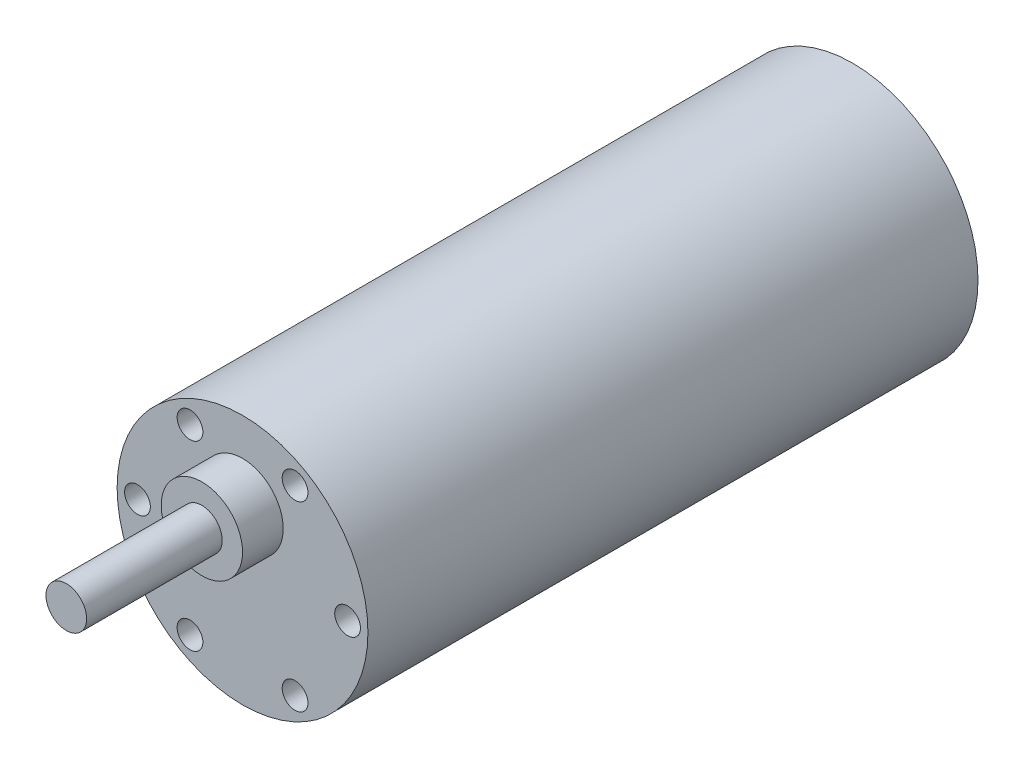
ISO-10303-21;
HEADER;
FILE_DESCRIPTION(('STEP AP214'),'2;1');
FILE_NAME('part.step','',(''),(''),'','','');
FILE_SCHEMA(('AUTOMOTIVE_DESIGN { 1 0 10303 214 1 1 1 1 }'));
ENDSEC;
DATA;
#1=APPLICATION_CONTEXT('core data for automotive mechanical design processes');
#2=APPLICATION_PROTOCOL_DEFINITION('international standard','automotive_design',2000,#1);
#3=PRODUCT_CONTEXT('',#1,'mechanical');
#4=PRODUCT('Part','Part','',(#3));
#5=PRODUCT_RELATED_PRODUCT_CATEGORY('part','',(#4));
#6=PRODUCT_DEFINITION_FORMATION('','',#4);
#7=PRODUCT_DEFINITION_CONTEXT('part definition',#1,'design');
#8=PRODUCT_DEFINITION('design','',#6,#7);
#9=PRODUCT_DEFINITION_SHAPE('','',#8);
#10=(LENGTH_UNIT() NAMED_UNIT(*) SI_UNIT(.MILLI.,.METRE.));
#11=(NAMED_UNIT(*) PLANE_ANGLE_UNIT() SI_UNIT($,.RADIAN.));
#12=(NAMED_UNIT(*) SI_UNIT($,.STERADIAN.) SOLID_ANGLE_UNIT());
#13=UNCERTAINTY_MEASURE_WITH_UNIT(LENGTH_MEASURE(1.E-05),#10,'distance_accuracy_value','');
#14=(GEOMETRIC_REPRESENTATION_CONTEXT(3) GLOBAL_UNCERTAINTY_ASSIGNED_CONTEXT((#13)) GLOBAL_UNIT_ASSIGNED_CONTEXT((#10,
#11,#12)) REPRESENTATION_CONTEXT('',''));
#15=CARTESIAN_POINT('',(0.,0.,0.));
#16=DIRECTION('',(0.,0.,1.));
#17=DIRECTION('',(1.,0.,0.));
#18=AXIS2_PLACEMENT_3D('',#15,#16,#17);
#19=CARTESIAN_POINT('',(0.,0.,90.));
#20=DIRECTION('',(0.,0.,-1.));
#21=DIRECTION('',(-1.,0.,0.));
#22=AXIS2_PLACEMENT_3D('',#19,#20,#21);
#23=CYLINDRICAL_SURFACE('',#22,18.5);
#24=CARTESIAN_POINT('',(0.,0.,90.));
#25=DIRECTION('',(0.,0.,1.));
#26=DIRECTION('',(1.,0.,0.));
#27=AXIS2_PLACEMENT_3D('',#24,#25,#26);
#28=CIRCLE('',#27,18.5);
#29=CARTESIAN_POINT('',(-18.5,0.,90.));
#30=VERTEX_POINT('',#29);
#31=EDGE_CURVE('E48',#30,#30,#28,.T.);
#32=CARTESIAN_POINT('',(0.,0.,0.));
#33=DIRECTION('',(0.,0.,1.));
#34=DIRECTION('',(1.,0.,0.));
#35=AXIS2_PLACEMENT_3D('',#32,#33,#34);
#36=CIRCLE('',#35,18.5);
#37=CARTESIAN_POINT('',(-18.5,0.,0.));
#38=VERTEX_POINT('',#37);
#39=EDGE_CURVE('E44',#38,#38,#36,.T.);
#40=CARTESIAN_POINT('',(-18.5,0.,90.));
#41=CARTESIAN_POINT('',(-18.5,0.,89.0625));
#42=CARTESIAN_POINT('',(-18.5,0.,88.125));
#43=CARTESIAN_POINT('',(-18.5,0.,86.25));
#44=CARTESIAN_POINT('',(-18.5,0.,85.3125));
#45=CARTESIAN_POINT('',(-18.5,0.,83.4375));
#46=CARTESIAN_POINT('',(-18.5,0.,82.5));
#47=CARTESIAN_POINT('',(-18.5,0.,80.625));
#48=CARTESIAN_POINT('',(-18.5,0.,79.6875));
#49=CARTESIAN_POINT('',(-18.5,0.,77.8125));
#50=CARTESIAN_POINT('',(-18.5,0.,76.875));
#51=CARTESIAN_POINT('',(-18.5,0.,75.));
#52=CARTESIAN_POINT('',(-18.5,0.,74.0625));
#53=CARTESIAN_POINT('',(-18.5,0.,72.1875));
#54=CARTESIAN_POINT('',(-18.5,0.,71.25));
#55=CARTESIAN_POINT('',(-18.5,0.,69.375));
#56=CARTESIAN_POINT('',(-18.5,0.,68.4375));
#57=CARTESIAN_POINT('',(-18.5,0.,66.5625));
#58=CARTESIAN_POINT('',(-18.5,0.,65.625));
#59=CARTESIAN_POINT('',(-18.5,0.,63.75));
#60=CARTESIAN_POINT('',(-18.5,0.,62.8125));
#61=CARTESIAN_POINT('',(-18.5,0.,60.9375));
#62=CARTESIAN_POINT('',(-18.5,0.,60.));
#63=CARTESIAN_POINT('',(-18.5,0.,58.125));
#64=CARTESIAN_POINT('',(-18.5,0.,57.1875));
#65=CARTESIAN_POINT('',(-18.5,0.,55.3125));
#66=CARTESIAN_POINT('',(-18.5,0.,54.375));
#67=CARTESIAN_POINT('',(-18.5,0.,52.5));
#68=CARTESIAN_POINT('',(-18.5,0.,51.5625));
#69=CARTESIAN_POINT('',(-18.5,0.,49.6875));
#70=CARTESIAN_POINT('',(-18.5,0.,48.75));
#71=CARTESIAN_POINT('',(-18.5,0.,46.875));
#72=CARTESIAN_POINT('',(-18.5,0.,45.9375));
#73=CARTESIAN_POINT('',(-18.5,0.,44.0625));
#74=CARTESIAN_POINT('',(-18.5,0.,43.125));
#75=CARTESIAN_POINT('',(-18.5,0.,41.25));
#76=CARTESIAN_POINT('',(-18.5,0.,40.3125));
#77=CARTESIAN_POINT('',(-18.5,0.,38.4375));
#78=CARTESIAN_POINT('',(-18.5,0.,37.5));
#79=CARTESIAN_POINT('',(-18.5,0.,35.625));
#80=CARTESIAN_POINT('',(-18.5,0.,34.6875));
#81=CARTESIAN_POINT('',(-18.5,0.,32.8125));
#82=CARTESIAN_POINT('',(-18.5,0.,31.875));
#83=CARTESIAN_POINT('',(-18.5,0.,30.));
#84=CARTESIAN_POINT('',(-18.5,0.,29.0625));
#85=CARTESIAN_POINT('',(-18.5,0.,27.1875));
#86=CARTESIAN_POINT('',(-18.5,0.,26.25));
#87=CARTESIAN_POINT('',(-18.5,0.,24.375));
#88=CARTESIAN_POINT('',(-18.5,0.,23.4375));
#89=CARTESIAN_POINT('',(-18.5,0.,21.5625));
#90=CARTESIAN_POINT('',(-18.5,0.,20.625));
#91=CARTESIAN_POINT('',(-18.5,0.,18.75));
#92=CARTESIAN_POINT('',(-18.5,0.,17.8125));
#93=CARTESIAN_POINT('',(-18.5,0.,15.9375));
#94=CARTESIAN_POINT('',(-18.5,0.,15.));
#95=CARTESIAN_POINT('',(-18.5,0.,13.125));
#96=CARTESIAN_POINT('',(-18.5,0.,12.1875));
#97=CARTESIAN_POINT('',(-18.5,0.,10.3125));
#98=CARTESIAN_POINT('',(-18.5,0.,9.37499999999999));
#99=CARTESIAN_POINT('',(-18.5,0.,7.49999999999999));
#100=CARTESIAN_POINT('',(-18.5,0.,6.56249999999999));
#101=CARTESIAN_POINT('',(-18.5,0.,4.68749999999999));
#102=CARTESIAN_POINT('',(-18.5,0.,3.74999999999998));
#103=CARTESIAN_POINT('',(-18.5,0.,1.87499999999998));
#104=CARTESIAN_POINT('',(-18.5,0.,0.937499999999986));
#105=CARTESIAN_POINT('',(-18.5,0.,0.));
#106=B_SPLINE_CURVE_WITH_KNOTS('',3,(#40,#41,#42,#43,#44,#45,#46,#47,#48,#49,#50,#51,#52,#53,
#54,#55,#56,#57,#58,#59,#60,#61,#62,#63,#64,#65,#66,#67,#68,#69,#70,#71,#72,#73,#74,#75,#76,#77,
#78,#79,#80,#81,#82,#83,#84,#85,#86,#87,#88,#89,#90,#91,#92,#93,#94,#95,#96,#97,#98,#99,#100,
#101,#102,#103,#104,#105),.UNSPECIFIED.,.F.,.F.,(4,2,2,2,2,2,2,2,2,2,2,2,2,2,2,2,2,2,2,2,2,2,2,
2,2,2,2,2,2,2,2,2,4),(0.,2.8125,5.62499999999999,8.43749999999999,11.25,14.0625,16.875,19.6875,
22.5,25.3125,28.125,30.9375,33.75,36.5625,39.375,42.1875,45.,47.8125,50.625,53.4375,56.25,
59.0625,61.875,64.6875,67.5,70.3125,73.125,75.9375,78.75,81.5625,84.375,87.1875,90.),.UNSPECIFIED.);
#107=EDGE_CURVE('BSEAM41',#30,#38,#106,.T.);
#108=ORIENTED_EDGE('',*,*,#31,.F.);
#109=ORIENTED_EDGE('',*,*,#39,.T.);
#110=ORIENTED_EDGE('',*,*,#107,.T.);
#111=ORIENTED_EDGE('',*,*,#107,.F.);
#112=EDGE_LOOP('',(#108,#110,#109,#111));
#113=FACE_BOUND('',#112,.T.);
#114=ADVANCED_FACE('F41',(#113),#23,.T.);
#115=CARTESIAN_POINT('',(0.,0.,90.));
#116=DIRECTION('',(0.,0.,1.));
#117=DIRECTION('',(1.,0.,0.));
#118=AXIS2_PLACEMENT_3D('',#115,#116,#117);
#119=PLANE('',#118);
#120=CARTESIAN_POINT('',(0.,7.,90.));
#121=DIRECTION('',(0.,0.,1.));
#122=DIRECTION('',(1.,0.,0.));
#123=AXIS2_PLACEMENT_3D('',#120,#121,#122);
#124=CIRCLE('',#123,5.99999999999997);
#125=CARTESIAN_POINT('',(5.99999999999997,7.,90.));
#126=VERTEX_POINT('',#125);
#127=EDGE_CURVE('E60',#126,#126,#124,.T.);
#128=ORIENTED_EDGE('',*,*,#127,.F.);
#129=EDGE_LOOP('',(#128));
#130=FACE_BOUND('',#129,.T.);
#131=CARTESIAN_POINT('',(15.5,0.,90.));
#132=DIRECTION('',(0.,0.,1.));
#133=DIRECTION('',(1.,0.,0.));
#134=AXIS2_PLACEMENT_3D('',#131,#132,#133);
#135=CIRCLE('',#134,1.9);
#136=CARTESIAN_POINT('',(17.4,0.,90.));
#137=VERTEX_POINT('',#136);
#138=EDGE_CURVE('E66',#137,#137,#135,.T.);
#139=ORIENTED_EDGE('',*,*,#138,.F.);
#140=EDGE_LOOP('',(#139));
#141=FACE_BOUND('',#140,.T.);
#142=CARTESIAN_POINT('',(7.75,13.4233937586588,90.));
#143=DIRECTION('',(0.,0.,1.));
#144=DIRECTION('',(1.,0.,0.));
#145=AXIS2_PLACEMENT_3D('',#142,#143,#144);
#146=CIRCLE('',#145,1.90000000000002);
#147=CARTESIAN_POINT('',(9.65000000000002,13.4233937586588,90.));
#148=VERTEX_POINT('',#147);
#149=EDGE_CURVE('E59',#148,#148,#146,.T.);
#150=ORIENTED_EDGE('',*,*,#149,.F.);
#151=EDGE_LOOP('',(#150));
#152=FACE_BOUND('',#151,.T.);
#153=CARTESIAN_POINT('',(-7.75000000000001,13.4233937586588,90.));
#154=DIRECTION('',(0.,0.,1.));
#155=DIRECTION('',(1.,0.,0.));
#156=AXIS2_PLACEMENT_3D('',#153,#154,#155);
#157=CIRCLE('',#156,1.9);
#158=CARTESIAN_POINT('',(-5.85,13.4233937586588,90.));
#159=VERTEX_POINT('',#158);
#160=EDGE_CURVE('E73',#159,#159,#157,.T.);
#161=ORIENTED_EDGE('',*,*,#160,.F.);
#162=EDGE_LOOP('',(#161));
#163=FACE_BOUND('',#162,.T.);
#164=CARTESIAN_POINT('',(-15.5,0.,90.));
#165=DIRECTION('',(0.,0.,1.));
#166=DIRECTION('',(1.,0.,0.));
#167=AXIS2_PLACEMENT_3D('',#164,#165,#166);
#168=CIRCLE('',#167,1.9);
#169=CARTESIAN_POINT('',(-13.6,0.,90.));
#170=VERTEX_POINT('',#169);
#171=EDGE_CURVE('E90',#170,#170,#168,.T.);
#172=ORIENTED_EDGE('',*,*,#171,.F.);
#173=EDGE_LOOP('',(#172));
#174=FACE_BOUND('',#173,.T.);
#175=CARTESIAN_POINT('',(-7.75,-13.4233937586588,90.));
#176=DIRECTION('',(0.,0.,1.));
#177=DIRECTION('',(1.,0.,0.));
#178=AXIS2_PLACEMENT_3D('',#175,#176,#177);
#179=CIRCLE('',#178,1.9);
#180=CARTESIAN_POINT('',(-5.85,-13.4233937586588,90.));
#181=VERTEX_POINT('',#180);
#182=EDGE_CURVE('E84',#181,#181,#179,.T.);
#183=ORIENTED_EDGE('',*,*,#182,.F.);
#184=EDGE_LOOP('',(#183));
#185=FACE_BOUND('',#184,.T.);
#186=CARTESIAN_POINT('',(7.75,-13.4233937586588,90.));
#187=DIRECTION('',(0.,0.,1.));
#188=DIRECTION('',(1.,0.,0.));
#189=AXIS2_PLACEMENT_3D('',#186,#187,#188);
#190=CIRCLE('',#189,1.9);
#191=CARTESIAN_POINT('',(9.65,-13.4233937586588,90.));
#192=VERTEX_POINT('',#191);
#193=EDGE_CURVE('E78',#192,#192,#190,.T.);
#194=ORIENTED_EDGE('',*,*,#193,.F.);
#195=EDGE_LOOP('',(#194));
#196=FACE_BOUND('',#195,.T.);
#197=ORIENTED_EDGE('',*,*,#31,.T.);
#198=EDGE_LOOP('',(#197));
#199=FACE_BOUND('',#198,.T.);
#200=ADVANCED_FACE('F101',(#130,#141,#152,#163,#174,#185,#196,#199),#119,.T.);
#201=CARTESIAN_POINT('',(0.,0.,0.));
#202=DIRECTION('',(0.,0.,1.));
#203=DIRECTION('',(1.,0.,0.));
#204=AXIS2_PLACEMENT_3D('',#201,#202,#203);
#205=PLANE('',#204);
#206=ORIENTED_EDGE('',*,*,#39,.F.);
#207=EDGE_LOOP('',(#206));
#208=FACE_BOUND('',#207,.T.);
#209=ADVANCED_FACE('F104',(#208),#205,.F.);
#210=CARTESIAN_POINT('',(7.75,-13.4233937586588,87.));
#211=DIRECTION('',(0.,0.,1.));
#212=DIRECTION('',(1.,0.,0.));
#213=AXIS2_PLACEMENT_3D('',#210,#211,#212);
#214=CYLINDRICAL_SURFACE('',#213,1.9);
#215=CARTESIAN_POINT('',(7.75,-13.4233937586588,87.));
#216=DIRECTION('',(0.,0.,1.));
#217=DIRECTION('',(1.,0.,0.));
#218=AXIS2_PLACEMENT_3D('',#215,#216,#217);
#219=CIRCLE('',#218,1.9);
#220=CARTESIAN_POINT('',(9.65,-13.4233937586588,87.));
#221=VERTEX_POINT('',#220);
#222=EDGE_CURVE('E69',#221,#221,#219,.T.);
#223=ORIENTED_EDGE('',*,*,#222,.F.);
#224=EDGE_LOOP('',(#223));
#225=FACE_BOUND('',#224,.T.);
#226=ORIENTED_EDGE('',*,*,#193,.T.);
#227=EDGE_LOOP('',(#226));
#228=FACE_BOUND('',#227,.T.);
#229=ADVANCED_FACE('F121',(#225,#228),#214,.F.);
#230=CARTESIAN_POINT('',(0.,0.,87.));
#231=DIRECTION('',(0.,0.,1.));
#232=DIRECTION('',(1.,0.,0.));
#233=AXIS2_PLACEMENT_3D('',#230,#231,#232);
#234=PLANE('',#233);
#235=ORIENTED_EDGE('',*,*,#222,.T.);
#236=EDGE_LOOP('',(#235));
#237=FACE_BOUND('',#236,.T.);
#238=ADVANCED_FACE('F125',(#237),#234,.T.);
#239=CARTESIAN_POINT('',(-7.75,-13.4233937586588,87.));
#240=DIRECTION('',(0.,0.,1.));
#241=DIRECTION('',(1.,0.,0.));
#242=AXIS2_PLACEMENT_3D('',#239,#240,#241);
#243=CYLINDRICAL_SURFACE('',#242,1.9);
#244=CARTESIAN_POINT('',(-7.75,-13.4233937586588,87.));
#245=DIRECTION('',(0.,0.,1.));
#246=DIRECTION('',(1.,0.,0.));
#247=AXIS2_PLACEMENT_3D('',#244,#245,#246);
#248=CIRCLE('',#247,1.9);
#249=CARTESIAN_POINT('',(-5.85,-13.4233937586588,87.));
#250=VERTEX_POINT('',#249);
#251=EDGE_CURVE('E81',#250,#250,#248,.T.);
#252=ORIENTED_EDGE('',*,*,#251,.F.);
#253=EDGE_LOOP('',(#252));
#254=FACE_BOUND('',#253,.T.);
#255=ORIENTED_EDGE('',*,*,#182,.T.);
#256=EDGE_LOOP('',(#255));
#257=FACE_BOUND('',#256,.T.);
#258=ADVANCED_FACE('F146',(#254,#257),#243,.F.);
#259=CARTESIAN_POINT('',(0.,0.,87.));
#260=DIRECTION('',(0.,0.,1.));
#261=DIRECTION('',(1.,0.,0.));
#262=AXIS2_PLACEMENT_3D('',#259,#260,#261);
#263=PLANE('',#262);
#264=ORIENTED_EDGE('',*,*,#251,.T.);
#265=EDGE_LOOP('',(#264));
#266=FACE_BOUND('',#265,.T.);
#267=ADVANCED_FACE('F141',(#266),#263,.T.);
#268=CARTESIAN_POINT('',(-15.5,0.,87.));
#269=DIRECTION('',(0.,0.,1.));
#270=DIRECTION('',(1.,0.,0.));
#271=AXIS2_PLACEMENT_3D('',#268,#269,#270);
#272=CYLINDRICAL_SURFACE('',#271,1.9);
#273=CARTESIAN_POINT('',(-15.5,0.,87.));
#274=DIRECTION('',(0.,0.,1.));
#275=DIRECTION('',(1.,0.,0.));
#276=AXIS2_PLACEMENT_3D('',#273,#274,#275);
#277=CIRCLE('',#276,1.9);
#278=CARTESIAN_POINT('',(-13.6,0.,87.));
#279=VERTEX_POINT('',#278);
#280=EDGE_CURVE('E87',#279,#279,#277,.T.);
#281=ORIENTED_EDGE('',*,*,#280,.F.);
#282=EDGE_LOOP('',(#281));
#283=FACE_BOUND('',#282,.T.);
#284=ORIENTED_EDGE('',*,*,#171,.T.);
#285=EDGE_LOOP('',(#284));
#286=FACE_BOUND('',#285,.T.);
#287=ADVANCED_FACE('F138',(#283,#286),#272,.F.);
#288=CARTESIAN_POINT('',(0.,0.,87.));
#289=DIRECTION('',(0.,0.,1.));
#290=DIRECTION('',(1.,0.,0.));
#291=AXIS2_PLACEMENT_3D('',#288,#289,#290);
#292=PLANE('',#291);
#293=ORIENTED_EDGE('',*,*,#280,.T.);
#294=EDGE_LOOP('',(#293));
#295=FACE_BOUND('',#294,.T.);
#296=ADVANCED_FACE('F132',(#295),#292,.T.);
#297=CARTESIAN_POINT('',(-7.75000000000001,13.4233937586588,87.));
#298=DIRECTION('',(0.,0.,1.));
#299=DIRECTION('',(1.,0.,0.));
#300=AXIS2_PLACEMENT_3D('',#297,#298,#299);
#301=CYLINDRICAL_SURFACE('',#300,1.9);
#302=CARTESIAN_POINT('',(-7.75000000000001,13.4233937586588,87.));
#303=DIRECTION('',(0.,0.,1.));
#304=DIRECTION('',(1.,0.,0.));
#305=AXIS2_PLACEMENT_3D('',#302,#303,#304);
#306=CIRCLE('',#305,1.9);
#307=CARTESIAN_POINT('',(-5.85,13.4233937586588,87.));
#308=VERTEX_POINT('',#307);
#309=EDGE_CURVE('E93',#308,#308,#306,.T.);
#310=ORIENTED_EDGE('',*,*,#309,.F.);
#311=EDGE_LOOP('',(#310));
#312=FACE_BOUND('',#311,.T.);
#313=ORIENTED_EDGE('',*,*,#160,.T.);
#314=EDGE_LOOP('',(#313));
#315=FACE_BOUND('',#314,.T.);
#316=ADVANCED_FACE('F99',(#312,#315),#301,.F.);
#317=CARTESIAN_POINT('',(0.,0.,87.));
#318=DIRECTION('',(0.,0.,1.));
#319=DIRECTION('',(1.,0.,0.));
#320=AXIS2_PLACEMENT_3D('',#317,#318,#319);
#321=PLANE('',#320);
#322=ORIENTED_EDGE('',*,*,#309,.T.);
#323=EDGE_LOOP('',(#322));
#324=FACE_BOUND('',#323,.T.);
#325=ADVANCED_FACE('F131',(#324),#321,.T.);
#326=CARTESIAN_POINT('',(7.75,13.4233937586588,87.));
#327=DIRECTION('',(0.,0.,1.));
#328=DIRECTION('',(1.,0.,0.));
#329=AXIS2_PLACEMENT_3D('',#326,#327,#328);
#330=CYLINDRICAL_SURFACE('',#329,1.90000000000002);
#331=CARTESIAN_POINT('',(7.75,13.4233937586588,87.));
#332=DIRECTION('',(0.,0.,1.));
#333=DIRECTION('',(1.,0.,0.));
#334=AXIS2_PLACEMENT_3D('',#331,#332,#333);
#335=CIRCLE('',#334,1.90000000000002);
#336=CARTESIAN_POINT('',(9.65000000000002,13.4233937586588,87.));
#337=VERTEX_POINT('',#336);
#338=EDGE_CURVE('E70',#337,#337,#335,.T.);
#339=ORIENTED_EDGE('',*,*,#338,.F.);
#340=EDGE_LOOP('',(#339));
#341=FACE_BOUND('',#340,.T.);
#342=ORIENTED_EDGE('',*,*,#149,.T.);
#343=EDGE_LOOP('',(#342));
#344=FACE_BOUND('',#343,.T.);
#345=ADVANCED_FACE('F136',(#341,#344),#330,.F.);
#346=CARTESIAN_POINT('',(0.,0.,87.));
#347=DIRECTION('',(0.,0.,1.));
#348=DIRECTION('',(1.,0.,0.));
#349=AXIS2_PLACEMENT_3D('',#346,#347,#348);
#350=PLANE('',#349);
#351=ORIENTED_EDGE('',*,*,#338,.T.);
#352=EDGE_LOOP('',(#351));
#353=FACE_BOUND('',#352,.T.);
#354=ADVANCED_FACE('F158',(#353),#350,.T.);
#355=CARTESIAN_POINT('',(15.5,0.,87.));
#356=DIRECTION('',(0.,0.,1.));
#357=DIRECTION('',(1.,0.,0.));
#358=AXIS2_PLACEMENT_3D('',#355,#356,#357);
#359=CYLINDRICAL_SURFACE('',#358,1.9);
#360=CARTESIAN_POINT('',(15.5,0.,87.));
#361=DIRECTION('',(0.,0.,1.));
#362=DIRECTION('',(1.,0.,0.));
#363=AXIS2_PLACEMENT_3D('',#360,#361,#362);
#364=CIRCLE('',#363,1.9);
#365=CARTESIAN_POINT('',(17.4,0.,87.));
#366=VERTEX_POINT('',#365);
#367=EDGE_CURVE('E63',#366,#366,#364,.T.);
#368=ORIENTED_EDGE('',*,*,#367,.F.);
#369=EDGE_LOOP('',(#368));
#370=FACE_BOUND('',#369,.T.);
#371=ORIENTED_EDGE('',*,*,#138,.T.);
#372=EDGE_LOOP('',(#371));
#373=FACE_BOUND('',#372,.T.);
#374=ADVANCED_FACE('F162',(#370,#373),#359,.F.);
#375=CARTESIAN_POINT('',(0.,0.,87.));
#376=DIRECTION('',(0.,0.,1.));
#377=DIRECTION('',(1.,0.,0.));
#378=AXIS2_PLACEMENT_3D('',#375,#376,#377);
#379=PLANE('',#378);
#380=ORIENTED_EDGE('',*,*,#367,.T.);
#381=EDGE_LOOP('',(#380));
#382=FACE_BOUND('',#381,.T.);
#383=ADVANCED_FACE('F166',(#382),#379,.T.);
#384=CARTESIAN_POINT('',(0.,7.,96.));
#385=DIRECTION('',(0.,0.,-1.));
#386=DIRECTION('',(-1.,0.,0.));
#387=AXIS2_PLACEMENT_3D('',#384,#385,#386);
#388=CYLINDRICAL_SURFACE('',#387,5.99999999999997);
#389=CARTESIAN_POINT('',(0.,7.,96.));
#390=DIRECTION('',(0.,0.,1.));
#391=DIRECTION('',(1.,0.,0.));
#392=AXIS2_PLACEMENT_3D('',#389,#390,#391);
#393=CIRCLE('',#392,5.99999999999997);
#394=CARTESIAN_POINT('',(5.99999999999997,7.,96.));
#395=VERTEX_POINT('',#394);
#396=EDGE_CURVE('E56',#395,#395,#393,.T.);
#397=ORIENTED_EDGE('',*,*,#396,.F.);
#398=EDGE_LOOP('',(#397));
#399=FACE_BOUND('',#398,.T.);
#400=ORIENTED_EDGE('',*,*,#127,.T.);
#401=EDGE_LOOP('',(#400));
#402=FACE_BOUND('',#401,.T.);
#403=ADVANCED_FACE('F170',(#399,#402),#388,.T.);
#404=CARTESIAN_POINT('',(0.,0.,96.));
#405=DIRECTION('',(0.,0.,1.));
#406=DIRECTION('',(1.,0.,0.));
#407=AXIS2_PLACEMENT_3D('',#404,#405,#406);
#408=PLANE('',#407);
#409=CARTESIAN_POINT('',(0.,7.,96.));
#410=DIRECTION('',(0.,0.,1.));
#411=DIRECTION('',(1.,0.,0.));
#412=AXIS2_PLACEMENT_3D('',#409,#410,#411);
#413=CIRCLE('',#412,3.);
#414=CARTESIAN_POINT('',(3.,7.,96.));
#415=VERTEX_POINT('',#414);
#416=EDGE_CURVE('E10',#415,#415,#413,.T.);
#417=ORIENTED_EDGE('',*,*,#416,.F.);
#418=EDGE_LOOP('',(#417));
#419=FACE_BOUND('',#418,.T.);
#420=ORIENTED_EDGE('',*,*,#396,.T.);
#421=EDGE_LOOP('',(#420));
#422=FACE_BOUND('',#421,.T.);
#423=ADVANCED_FACE('F174',(#419,#422),#408,.T.);
#424=CARTESIAN_POINT('',(0.,7.,116.));
#425=DIRECTION('',(0.,0.,-1.));
#426=DIRECTION('',(-1.,0.,0.));
#427=AXIS2_PLACEMENT_3D('',#424,#425,#426);
#428=CYLINDRICAL_SURFACE('',#427,3.);
#429=CARTESIAN_POINT('',(0.,7.,116.));
#430=DIRECTION('',(0.,0.,1.));
#431=DIRECTION('',(1.,0.,0.));
#432=AXIS2_PLACEMENT_3D('',#429,#430,#431);
#433=CIRCLE('',#432,3.);
#434=CARTESIAN_POINT('',(3.,7.,116.));
#435=VERTEX_POINT('',#434);
#436=EDGE_CURVE('E55',#435,#435,#433,.T.);
#437=ORIENTED_EDGE('',*,*,#436,.F.);
#438=EDGE_LOOP('',(#437));
#439=FACE_BOUND('',#438,.T.);
#440=ORIENTED_EDGE('',*,*,#416,.T.);
#441=EDGE_LOOP('',(#440));
#442=FACE_BOUND('',#441,.T.);
#443=ADVANCED_FACE('F178',(#439,#442),#428,.T.);
#444=CARTESIAN_POINT('',(0.,7.,116.));
#445=DIRECTION('',(0.,0.,1.));
#446=DIRECTION('',(1.,0.,0.));
#447=AXIS2_PLACEMENT_3D('',#444,#445,#446);
#448=PLANE('',#447);
#449=ORIENTED_EDGE('',*,*,#436,.T.);
#450=EDGE_LOOP('',(#449));
#451=FACE_BOUND('',#450,.T.);
#452=ADVANCED_FACE('F182',(#451),#448,.T.);
#453=CLOSED_SHELL('',(#114,#200,#209,#229,#238,#258,#267,#287,#296,#316,#325,#345,#354,#374,
#383,#403,#423,#443,#452));
#454=MANIFOLD_SOLID_BREP('B2',#453);
#455=ADVANCED_BREP_SHAPE_REPRESENTATION('',(#18,#454),#14);
#456=SHAPE_DEFINITION_REPRESENTATION(#9,#455);
ENDSEC;
END-ISO-10303-21;
